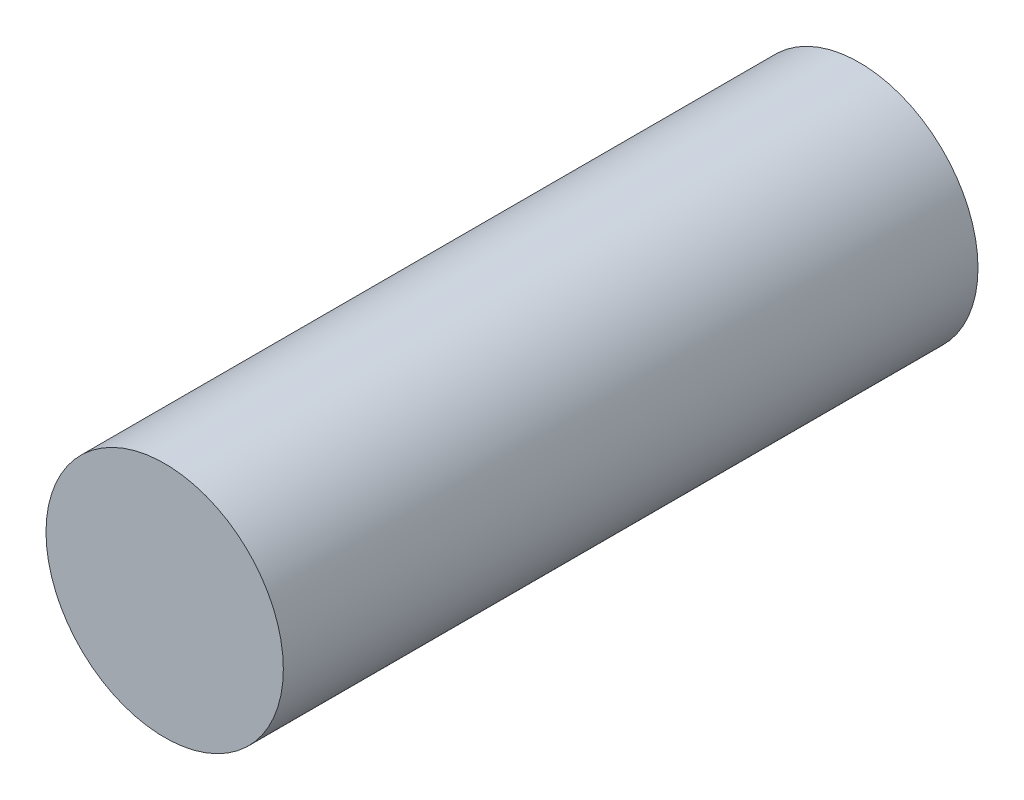
ISO-10303-21;
HEADER;
FILE_DESCRIPTION(('STEP AP214'),'2;1');
FILE_NAME('part.step','',(''),(''),'','','');
FILE_SCHEMA(('AUTOMOTIVE_DESIGN { 1 0 10303 214 1 1 1 1 }'));
ENDSEC;
DATA;
#1=APPLICATION_CONTEXT('core data for automotive mechanical design processes');
#2=APPLICATION_PROTOCOL_DEFINITION('international standard','automotive_design',2000,#1);
#3=PRODUCT_CONTEXT('',#1,'mechanical');
#4=PRODUCT('Part','Part','',(#3));
#5=PRODUCT_RELATED_PRODUCT_CATEGORY('part','',(#4));
#6=PRODUCT_DEFINITION_FORMATION('','',#4);
#7=PRODUCT_DEFINITION_CONTEXT('part definition',#1,'design');
#8=PRODUCT_DEFINITION('design','',#6,#7);
#9=PRODUCT_DEFINITION_SHAPE('','',#8);
#10=(LENGTH_UNIT() NAMED_UNIT(*) SI_UNIT(.MILLI.,.METRE.));
#11=(NAMED_UNIT(*) PLANE_ANGLE_UNIT() SI_UNIT($,.RADIAN.));
#12=(NAMED_UNIT(*) SI_UNIT($,.STERADIAN.) SOLID_ANGLE_UNIT());
#13=UNCERTAINTY_MEASURE_WITH_UNIT(LENGTH_MEASURE(1.E-05),#10,'distance_accuracy_value','');
#14=(GEOMETRIC_REPRESENTATION_CONTEXT(3) GLOBAL_UNCERTAINTY_ASSIGNED_CONTEXT((#13)) GLOBAL_UNIT_ASSIGNED_CONTEXT((#10,
#11,#12)) REPRESENTATION_CONTEXT('',''));
#15=CARTESIAN_POINT('',(0.,0.,0.));
#16=DIRECTION('',(0.,0.,1.));
#17=DIRECTION('',(1.,0.,0.));
#18=AXIS2_PLACEMENT_3D('',#15,#16,#17);
#19=CARTESIAN_POINT('',(0.,0.,0.));
#20=DIRECTION('',(0.,0.,1.));
#21=DIRECTION('',(1.,0.,0.));
#22=AXIS2_PLACEMENT_3D('',#19,#20,#21);
#23=PLANE('',#22);
#24=CARTESIAN_POINT('',(0.,-1.,0.));
#25=DIRECTION('',(0.,0.,1.));
#26=DIRECTION('',(1.,0.,0.));
#27=AXIS2_PLACEMENT_3D('',#24,#25,#26);
#28=CIRCLE('',#27,4.1);
#29=CARTESIAN_POINT('',(4.1,-1.,0.));
#30=VERTEX_POINT('',#29);
#31=EDGE_CURVE('E11',#30,#30,#28,.T.);
#32=ORIENTED_EDGE('',*,*,#31,.F.);
#33=EDGE_LOOP('',(#32));
#34=FACE_BOUND('',#33,.T.);
#35=ADVANCED_FACE('F40',(#34),#23,.F.);
#36=CARTESIAN_POINT('',(0.,-1.,0.));
#37=DIRECTION('',(0.,0.,1.));
#38=DIRECTION('',(1.,0.,0.));
#39=AXIS2_PLACEMENT_3D('',#36,#37,#38);
#40=CYLINDRICAL_SURFACE('',#39,4.1);
#41=ORIENTED_EDGE('',*,*,#31,.T.);
#42=EDGE_LOOP('',(#41));
#43=FACE_BOUND('',#42,.T.);
#44=CARTESIAN_POINT('',(0.,-1.,24.));
#45=DIRECTION('',(0.,0.,1.));
#46=DIRECTION('',(1.,0.,0.));
#47=AXIS2_PLACEMENT_3D('',#44,#45,#46);
#48=CIRCLE('',#47,4.1);
#49=CARTESIAN_POINT('',(4.1,-1.,24.));
#50=VERTEX_POINT('',#49);
#51=EDGE_CURVE('E43',#50,#50,#48,.T.);
#52=ORIENTED_EDGE('',*,*,#51,.F.);
#53=EDGE_LOOP('',(#52));
#54=FACE_BOUND('',#53,.T.);
#55=ADVANCED_FACE('F54',(#43,#54),#40,.T.);
#56=CARTESIAN_POINT('',(0.,0.,24.));
#57=DIRECTION('',(0.,0.,1.));
#58=DIRECTION('',(1.,0.,0.));
#59=AXIS2_PLACEMENT_3D('',#56,#57,#58);
#60=PLANE('',#59);
#61=ORIENTED_EDGE('',*,*,#51,.T.);
#62=EDGE_LOOP('',(#61));
#63=FACE_BOUND('',#62,.T.);
#64=ADVANCED_FACE('F52',(#63),#60,.T.);
#65=CLOSED_SHELL('',(#35,#55,#64));
#66=MANIFOLD_SOLID_BREP('B2',#65);
#67=ADVANCED_BREP_SHAPE_REPRESENTATION('',(#18,#66),#14);
#68=SHAPE_DEFINITION_REPRESENTATION(#9,#67);
ENDSEC;
END-ISO-10303-21;
